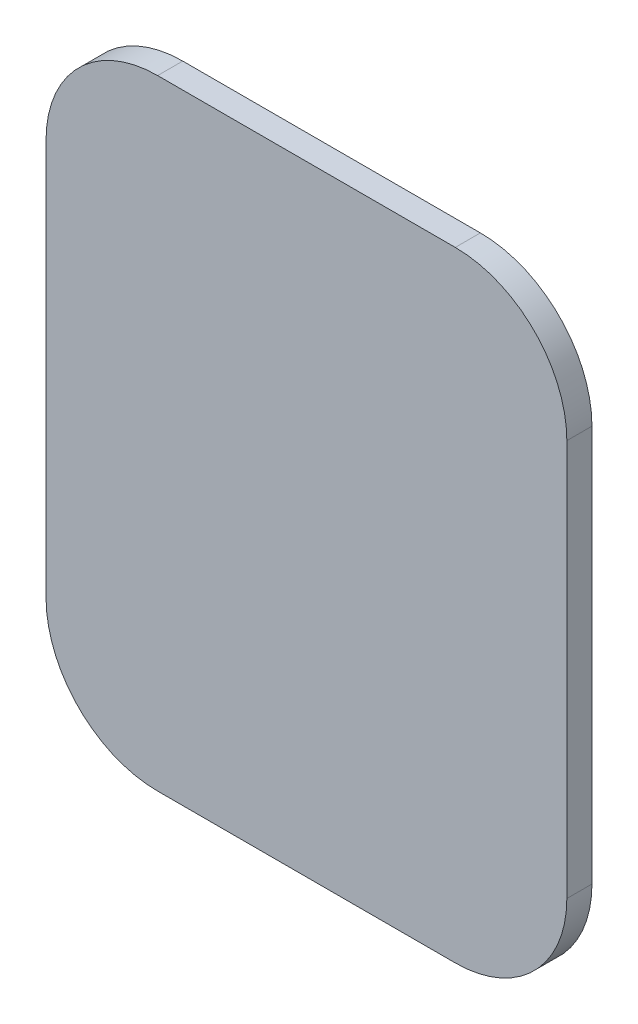
ISO-10303-21;
HEADER;
FILE_DESCRIPTION(('STEP AP214'),'2;1');
FILE_NAME('part.step','',(''),(''),'','','');
FILE_SCHEMA(('AUTOMOTIVE_DESIGN { 1 0 10303 214 1 1 1 1 }'));
ENDSEC;
DATA;
#1=APPLICATION_CONTEXT('core data for automotive mechanical design processes');
#2=APPLICATION_PROTOCOL_DEFINITION('international standard','automotive_design',2000,#1);
#3=PRODUCT_CONTEXT('',#1,'mechanical');
#4=PRODUCT('Part','Part','',(#3));
#5=PRODUCT_RELATED_PRODUCT_CATEGORY('part','',(#4));
#6=PRODUCT_DEFINITION_FORMATION('','',#4);
#7=PRODUCT_DEFINITION_CONTEXT('part definition',#1,'design');
#8=PRODUCT_DEFINITION('design','',#6,#7);
#9=PRODUCT_DEFINITION_SHAPE('','',#8);
#10=(LENGTH_UNIT() NAMED_UNIT(*) SI_UNIT(.MILLI.,.METRE.));
#11=(NAMED_UNIT(*) PLANE_ANGLE_UNIT() SI_UNIT($,.RADIAN.));
#12=(NAMED_UNIT(*) SI_UNIT($,.STERADIAN.) SOLID_ANGLE_UNIT());
#13=UNCERTAINTY_MEASURE_WITH_UNIT(LENGTH_MEASURE(1.E-05),#10,'distance_accuracy_value','');
#14=(GEOMETRIC_REPRESENTATION_CONTEXT(3) GLOBAL_UNCERTAINTY_ASSIGNED_CONTEXT((#13)) GLOBAL_UNIT_ASSIGNED_CONTEXT((#10,
#11,#12)) REPRESENTATION_CONTEXT('',''));
#15=CARTESIAN_POINT('',(0.,0.,0.));
#16=DIRECTION('',(0.,0.,1.));
#17=DIRECTION('',(1.,0.,0.));
#18=AXIS2_PLACEMENT_3D('',#15,#16,#17);
#19=CARTESIAN_POINT('',(0.,0.,0.));
#20=DIRECTION('',(0.,0.,1.));
#21=DIRECTION('',(1.,0.,0.));
#22=AXIS2_PLACEMENT_3D('',#19,#20,#21);
#23=PLANE('',#22);
#24=DIRECTION('',(0.,-1.,0.));
#25=VECTOR('',#24,1.);
#26=CARTESIAN_POINT('',(-18.67,22.215,0.));
#27=LINE('',#26,#25);
#28=CARTESIAN_POINT('',(-18.67,14.215,0.));
#29=VERTEX_POINT('',#28);
#30=CARTESIAN_POINT('',(-18.67,-14.215,0.));
#31=VERTEX_POINT('',#30);
#32=EDGE_CURVE('E170',#29,#31,#27,.T.);
#33=ORIENTED_EDGE('',*,*,#32,.F.);
#34=CARTESIAN_POINT('',(-10.67,14.215,0.));
#35=DIRECTION('',(0.,0.,1.));
#36=DIRECTION('',(1.,0.,0.));
#37=AXIS2_PLACEMENT_3D('',#34,#35,#36);
#38=CIRCLE('',#37,8.);
#39=CARTESIAN_POINT('',(-10.67,22.215,0.));
#40=VERTEX_POINT('',#39);
#41=EDGE_CURVE('E153',#29,#40,#38,.F.);
#42=ORIENTED_EDGE('',*,*,#41,.T.);
#43=DIRECTION('',(-1.,0.,0.));
#44=VECTOR('',#43,1.);
#45=CARTESIAN_POINT('',(-18.67,22.215,0.));
#46=LINE('',#45,#44);
#47=CARTESIAN_POINT('',(10.67,22.215,0.));
#48=VERTEX_POINT('',#47);
#49=EDGE_CURVE('E179',#48,#40,#46,.T.);
#50=ORIENTED_EDGE('',*,*,#49,.F.);
#51=CARTESIAN_POINT('',(10.67,14.215,0.));
#52=DIRECTION('',(0.,0.,1.));
#53=DIRECTION('',(1.,0.,0.));
#54=AXIS2_PLACEMENT_3D('',#51,#52,#53);
#55=CIRCLE('',#54,8.);
#56=CARTESIAN_POINT('',(18.67,14.215,0.));
#57=VERTEX_POINT('',#56);
#58=EDGE_CURVE('E164',#48,#57,#55,.F.);
#59=ORIENTED_EDGE('',*,*,#58,.T.);
#60=DIRECTION('',(0.,1.,0.));
#61=VECTOR('',#60,1.);
#62=CARTESIAN_POINT('',(18.67,22.215,0.));
#63=LINE('',#62,#61);
#64=CARTESIAN_POINT('',(18.67,-14.215,0.));
#65=VERTEX_POINT('',#64);
#66=EDGE_CURVE('E184',#65,#57,#63,.T.);
#67=ORIENTED_EDGE('',*,*,#66,.F.);
#68=CARTESIAN_POINT('',(10.67,-14.215,0.));
#69=DIRECTION('',(0.,0.,1.));
#70=DIRECTION('',(1.,0.,0.));
#71=AXIS2_PLACEMENT_3D('',#68,#69,#70);
#72=CIRCLE('',#71,8.);
#73=CARTESIAN_POINT('',(10.67,-22.215,0.));
#74=VERTEX_POINT('',#73);
#75=EDGE_CURVE('E191',#65,#74,#72,.F.);
#76=ORIENTED_EDGE('',*,*,#75,.T.);
#77=DIRECTION('',(1.,0.,0.));
#78=VECTOR('',#77,1.);
#79=CARTESIAN_POINT('',(-18.67,-22.215,0.));
#80=LINE('',#79,#78);
#81=CARTESIAN_POINT('',(-10.67,-22.215,0.));
#82=VERTEX_POINT('',#81);
#83=EDGE_CURVE('E178',#82,#74,#80,.T.);
#84=ORIENTED_EDGE('',*,*,#83,.F.);
#85=CARTESIAN_POINT('',(-10.67,-14.215,0.));
#86=DIRECTION('',(0.,0.,1.));
#87=DIRECTION('',(1.,0.,0.));
#88=AXIS2_PLACEMENT_3D('',#85,#86,#87);
#89=CIRCLE('',#88,8.);
#90=EDGE_CURVE('E174',#82,#31,#89,.F.);
#91=ORIENTED_EDGE('',*,*,#90,.T.);
#92=EDGE_LOOP('',(#33,#42,#50,#59,#67,#76,#84,#91));
#93=FACE_BOUND('',#92,.T.);
#94=DIRECTION('',(-1.,0.,0.));
#95=VECTOR('',#94,1.);
#96=CARTESIAN_POINT('',(15.5,-17.5,0.));
#97=LINE('',#96,#95);
#98=CARTESIAN_POINT('',(7.5,-17.5,0.));
#99=VERTEX_POINT('',#98);
#100=CARTESIAN_POINT('',(-7.5,-17.5,0.));
#101=VERTEX_POINT('',#100);
#102=EDGE_CURVE('E255',#99,#101,#97,.T.);
#103=ORIENTED_EDGE('',*,*,#102,.F.);
#104=CARTESIAN_POINT('',(7.5,-9.5,0.));
#105=DIRECTION('',(0.,0.,1.));
#106=DIRECTION('',(1.,0.,0.));
#107=AXIS2_PLACEMENT_3D('',#104,#105,#106);
#108=CIRCLE('',#107,8.);
#109=CARTESIAN_POINT('',(15.5,-9.5,0.));
#110=VERTEX_POINT('',#109);
#111=EDGE_CURVE('E242',#99,#110,#108,.T.);
#112=ORIENTED_EDGE('',*,*,#111,.T.);
#113=DIRECTION('',(0.,-1.,0.));
#114=VECTOR('',#113,1.);
#115=CARTESIAN_POINT('',(15.5,17.5,0.));
#116=LINE('',#115,#114);
#117=CARTESIAN_POINT('',(15.5,9.5,0.));
#118=VERTEX_POINT('',#117);
#119=EDGE_CURVE('E280',#118,#110,#116,.T.);
#120=ORIENTED_EDGE('',*,*,#119,.F.);
#121=CARTESIAN_POINT('',(7.5,9.5,0.));
#122=DIRECTION('',(0.,0.,1.));
#123=DIRECTION('',(1.,0.,0.));
#124=AXIS2_PLACEMENT_3D('',#121,#122,#123);
#125=CIRCLE('',#124,8.);
#126=CARTESIAN_POINT('',(7.5,17.5,0.));
#127=VERTEX_POINT('',#126);
#128=EDGE_CURVE('E11',#118,#127,#125,.T.);
#129=ORIENTED_EDGE('',*,*,#128,.T.);
#130=DIRECTION('',(-1.,0.,0.));
#131=VECTOR('',#130,1.);
#132=CARTESIAN_POINT('',(15.5,17.5,0.));
#133=LINE('',#132,#131);
#134=CARTESIAN_POINT('',(-7.5,17.5,0.));
#135=VERTEX_POINT('',#134);
#136=EDGE_CURVE('E249',#127,#135,#133,.T.);
#137=ORIENTED_EDGE('',*,*,#136,.T.);
#138=CARTESIAN_POINT('',(-7.5,9.5,0.));
#139=DIRECTION('',(0.,0.,1.));
#140=DIRECTION('',(1.,0.,0.));
#141=AXIS2_PLACEMENT_3D('',#138,#139,#140);
#142=CIRCLE('',#141,8.);
#143=CARTESIAN_POINT('',(-15.5,9.5,0.));
#144=VERTEX_POINT('',#143);
#145=EDGE_CURVE('E49',#135,#144,#142,.T.);
#146=ORIENTED_EDGE('',*,*,#145,.T.);
#147=DIRECTION('',(0.,-1.,0.));
#148=VECTOR('',#147,1.);
#149=CARTESIAN_POINT('',(-15.5,17.5,0.));
#150=LINE('',#149,#148);
#151=CARTESIAN_POINT('',(-15.5,-9.5,0.));
#152=VERTEX_POINT('',#151);
#153=EDGE_CURVE('E248',#144,#152,#150,.T.);
#154=ORIENTED_EDGE('',*,*,#153,.T.);
#155=CARTESIAN_POINT('',(-7.5,-9.5,0.));
#156=DIRECTION('',(0.,0.,1.));
#157=DIRECTION('',(1.,0.,0.));
#158=AXIS2_PLACEMENT_3D('',#155,#156,#157);
#159=CIRCLE('',#158,8.);
#160=EDGE_CURVE('E244',#152,#101,#159,.T.);
#161=ORIENTED_EDGE('',*,*,#160,.T.);
#162=EDGE_LOOP('',(#103,#112,#120,#129,#137,#146,#154,#161));
#163=FACE_BOUND('',#162,.T.);
#164=ADVANCED_FACE('F41',(#93,#163),#23,.F.);
#165=CARTESIAN_POINT('',(18.67,22.215,1.8));
#166=DIRECTION('',(-1.,0.,0.));
#167=DIRECTION('',(0.,0.,1.));
#168=AXIS2_PLACEMENT_3D('',#165,#166,#167);
#169=PLANE('',#168);
#170=ORIENTED_EDGE('',*,*,#66,.T.);
#171=DIRECTION('',(0.,0.,-1.));
#172=VECTOR('',#171,1.);
#173=CARTESIAN_POINT('',(18.67,14.215,1.8));
#174=LINE('',#173,#172);
#175=CARTESIAN_POINT('',(18.67,14.215,1.8));
#176=VERTEX_POINT('',#175);
#177=EDGE_CURVE('E208',#57,#176,#174,.F.);
#178=ORIENTED_EDGE('',*,*,#177,.T.);
#179=DIRECTION('',(0.,1.,0.));
#180=VECTOR('',#179,1.);
#181=CARTESIAN_POINT('',(18.67,22.215,1.8));
#182=LINE('',#181,#180);
#183=CARTESIAN_POINT('',(18.67,-14.215,1.8));
#184=VERTEX_POINT('',#183);
#185=EDGE_CURVE('E182',#184,#176,#182,.T.);
#186=ORIENTED_EDGE('',*,*,#185,.F.);
#187=DIRECTION('',(0.,0.,-1.));
#188=VECTOR('',#187,1.);
#189=CARTESIAN_POINT('',(18.67,-14.215,1.8));
#190=LINE('',#189,#188);
#191=EDGE_CURVE('E205',#184,#65,#190,.T.);
#192=ORIENTED_EDGE('',*,*,#191,.T.);
#193=EDGE_LOOP('',(#170,#178,#186,#192));
#194=FACE_BOUND('',#193,.T.);
#195=ADVANCED_FACE('F294',(#194),#169,.F.);
#196=CARTESIAN_POINT('',(-18.67,22.215,1.8));
#197=DIRECTION('',(0.,-1.,0.));
#198=DIRECTION('',(0.,0.,-1.));
#199=AXIS2_PLACEMENT_3D('',#196,#197,#198);
#200=PLANE('',#199);
#201=ORIENTED_EDGE('',*,*,#49,.T.);
#202=DIRECTION('',(0.,0.,-1.));
#203=VECTOR('',#202,1.);
#204=CARTESIAN_POINT('',(-10.67,22.215,1.8));
#205=LINE('',#204,#203);
#206=CARTESIAN_POINT('',(-10.67,22.215,1.8));
#207=VERTEX_POINT('',#206);
#208=EDGE_CURVE('E158',#40,#207,#205,.F.);
#209=ORIENTED_EDGE('',*,*,#208,.T.);
#210=DIRECTION('',(-1.,0.,0.));
#211=VECTOR('',#210,1.);
#212=CARTESIAN_POINT('',(-18.67,22.215,1.8));
#213=LINE('',#212,#211);
#214=CARTESIAN_POINT('',(10.67,22.215,1.8));
#215=VERTEX_POINT('',#214);
#216=EDGE_CURVE('E285',#215,#207,#213,.T.);
#217=ORIENTED_EDGE('',*,*,#216,.F.);
#218=DIRECTION('',(0.,0.,-1.));
#219=VECTOR('',#218,1.);
#220=CARTESIAN_POINT('',(10.67,22.215,1.8));
#221=LINE('',#220,#219);
#222=EDGE_CURVE('E163',#215,#48,#221,.T.);
#223=ORIENTED_EDGE('',*,*,#222,.T.);
#224=EDGE_LOOP('',(#201,#209,#217,#223));
#225=FACE_BOUND('',#224,.T.);
#226=ADVANCED_FACE('F305',(#225),#200,.F.);
#227=CARTESIAN_POINT('',(-18.67,22.215,1.8));
#228=DIRECTION('',(1.,0.,0.));
#229=DIRECTION('',(0.,0.,-1.));
#230=AXIS2_PLACEMENT_3D('',#227,#228,#229);
#231=PLANE('',#230);
#232=DIRECTION('',(0.,-1.,0.));
#233=VECTOR('',#232,1.);
#234=CARTESIAN_POINT('',(-18.67,22.215,1.8));
#235=LINE('',#234,#233);
#236=CARTESIAN_POINT('',(-18.67,14.215,1.8));
#237=VERTEX_POINT('',#236);
#238=CARTESIAN_POINT('',(-18.67,-14.215,1.8));
#239=VERTEX_POINT('',#238);
#240=EDGE_CURVE('E173',#237,#239,#235,.T.);
#241=ORIENTED_EDGE('',*,*,#240,.F.);
#242=DIRECTION('',(0.,0.,-1.));
#243=VECTOR('',#242,1.);
#244=CARTESIAN_POINT('',(-18.67,14.215,1.8));
#245=LINE('',#244,#243);
#246=EDGE_CURVE('E157',#237,#29,#245,.T.);
#247=ORIENTED_EDGE('',*,*,#246,.T.);
#248=ORIENTED_EDGE('',*,*,#32,.T.);
#249=DIRECTION('',(0.,0.,-1.));
#250=VECTOR('',#249,1.);
#251=CARTESIAN_POINT('',(-18.67,-14.215,1.8));
#252=LINE('',#251,#250);
#253=EDGE_CURVE('E175',#31,#239,#252,.F.);
#254=ORIENTED_EDGE('',*,*,#253,.T.);
#255=EDGE_LOOP('',(#241,#247,#248,#254));
#256=FACE_BOUND('',#255,.T.);
#257=ADVANCED_FACE('F169',(#256),#231,.F.);
#258=CARTESIAN_POINT('',(-18.67,-22.215,1.8));
#259=DIRECTION('',(0.,1.,0.));
#260=DIRECTION('',(0.,0.,1.));
#261=AXIS2_PLACEMENT_3D('',#258,#259,#260);
#262=PLANE('',#261);
#263=ORIENTED_EDGE('',*,*,#83,.T.);
#264=DIRECTION('',(0.,0.,-1.));
#265=VECTOR('',#264,1.);
#266=CARTESIAN_POINT('',(10.67,-22.215,1.8));
#267=LINE('',#266,#265);
#268=CARTESIAN_POINT('',(10.67,-22.215,1.8));
#269=VERTEX_POINT('',#268);
#270=EDGE_CURVE('E213',#74,#269,#267,.F.);
#271=ORIENTED_EDGE('',*,*,#270,.T.);
#272=DIRECTION('',(1.,0.,0.));
#273=VECTOR('',#272,1.);
#274=CARTESIAN_POINT('',(-18.67,-22.215,1.8));
#275=LINE('',#274,#273);
#276=CARTESIAN_POINT('',(-10.67,-22.215,1.8));
#277=VERTEX_POINT('',#276);
#278=EDGE_CURVE('E188',#277,#269,#275,.T.);
#279=ORIENTED_EDGE('',*,*,#278,.F.);
#280=DIRECTION('',(0.,0.,-1.));
#281=VECTOR('',#280,1.);
#282=CARTESIAN_POINT('',(-10.67,-22.215,1.8));
#283=LINE('',#282,#281);
#284=EDGE_CURVE('E210',#277,#82,#283,.T.);
#285=ORIENTED_EDGE('',*,*,#284,.T.);
#286=EDGE_LOOP('',(#263,#271,#279,#285));
#287=FACE_BOUND('',#286,.T.);
#288=ADVANCED_FACE('F312',(#287),#262,.F.);
#289=CARTESIAN_POINT('',(0.,0.,1.8));
#290=DIRECTION('',(0.,0.,1.));
#291=DIRECTION('',(1.,0.,0.));
#292=AXIS2_PLACEMENT_3D('',#289,#290,#291);
#293=PLANE('',#292);
#294=ORIENTED_EDGE('',*,*,#216,.T.);
#295=CARTESIAN_POINT('',(-10.67,14.215,1.8));
#296=DIRECTION('',(0.,0.,1.));
#297=DIRECTION('',(1.,0.,0.));
#298=AXIS2_PLACEMENT_3D('',#295,#296,#297);
#299=CIRCLE('',#298,8.);
#300=EDGE_CURVE('E203',#207,#237,#299,.T.);
#301=ORIENTED_EDGE('',*,*,#300,.T.);
#302=ORIENTED_EDGE('',*,*,#240,.T.);
#303=CARTESIAN_POINT('',(-10.67,-14.215,1.8));
#304=DIRECTION('',(0.,0.,1.));
#305=DIRECTION('',(1.,0.,0.));
#306=AXIS2_PLACEMENT_3D('',#303,#304,#305);
#307=CIRCLE('',#306,8.);
#308=EDGE_CURVE('E197',#239,#277,#307,.T.);
#309=ORIENTED_EDGE('',*,*,#308,.T.);
#310=ORIENTED_EDGE('',*,*,#278,.T.);
#311=CARTESIAN_POINT('',(10.67,-14.215,1.8));
#312=DIRECTION('',(0.,0.,1.));
#313=DIRECTION('',(1.,0.,0.));
#314=AXIS2_PLACEMENT_3D('',#311,#312,#313);
#315=CIRCLE('',#314,8.);
#316=EDGE_CURVE('E199',#269,#184,#315,.T.);
#317=ORIENTED_EDGE('',*,*,#316,.T.);
#318=ORIENTED_EDGE('',*,*,#185,.T.);
#319=CARTESIAN_POINT('',(10.67,14.215,1.8));
#320=DIRECTION('',(0.,0.,1.));
#321=DIRECTION('',(1.,0.,0.));
#322=AXIS2_PLACEMENT_3D('',#319,#320,#321);
#323=CIRCLE('',#322,8.);
#324=EDGE_CURVE('E201',#176,#215,#323,.T.);
#325=ORIENTED_EDGE('',*,*,#324,.T.);
#326=EDGE_LOOP('',(#294,#301,#302,#309,#310,#317,#318,#325));
#327=FACE_BOUND('',#326,.T.);
#328=ADVANCED_FACE('F303',(#327),#293,.T.);
#329=CARTESIAN_POINT('',(15.5,-17.5,-1.89));
#330=DIRECTION('',(0.,1.,0.));
#331=DIRECTION('',(0.,0.,1.));
#332=AXIS2_PLACEMENT_3D('',#329,#330,#331);
#333=PLANE('',#332);
#334=DIRECTION('',(-1.,0.,0.));
#335=VECTOR('',#334,1.);
#336=CARTESIAN_POINT('',(15.5,-17.5,-1.89));
#337=LINE('',#336,#335);
#338=CARTESIAN_POINT('',(7.5,-17.5,-1.89));
#339=VERTEX_POINT('',#338);
#340=CARTESIAN_POINT('',(-7.5,-17.5,-1.89));
#341=VERTEX_POINT('',#340);
#342=EDGE_CURVE('E273',#339,#341,#337,.T.);
#343=ORIENTED_EDGE('',*,*,#342,.F.);
#344=DIRECTION('',(0.,0.,1.));
#345=VECTOR('',#344,1.);
#346=CARTESIAN_POINT('',(7.5,-17.5,-1.89));
#347=LINE('',#346,#345);
#348=EDGE_CURVE('E217',#339,#99,#347,.T.);
#349=ORIENTED_EDGE('',*,*,#348,.T.);
#350=ORIENTED_EDGE('',*,*,#102,.T.);
#351=DIRECTION('',(0.,0.,1.));
#352=VECTOR('',#351,1.);
#353=CARTESIAN_POINT('',(-7.5,-17.5,-1.89));
#354=LINE('',#353,#352);
#355=EDGE_CURVE('E215',#101,#341,#354,.F.);
#356=ORIENTED_EDGE('',*,*,#355,.T.);
#357=EDGE_LOOP('',(#343,#349,#350,#356));
#358=FACE_BOUND('',#357,.T.);
#359=ADVANCED_FACE('F329',(#358),#333,.F.);
#360=CARTESIAN_POINT('',(-15.5,17.5,-1.89));
#361=DIRECTION('',(-1.,0.,0.));
#362=DIRECTION('',(0.,0.,1.));
#363=AXIS2_PLACEMENT_3D('',#360,#361,#362);
#364=PLANE('',#363);
#365=DIRECTION('',(0.,-1.,0.));
#366=VECTOR('',#365,1.);
#367=CARTESIAN_POINT('',(-15.5,17.5,-1.89));
#368=LINE('',#367,#366);
#369=CARTESIAN_POINT('',(-15.5,9.5,-1.89));
#370=VERTEX_POINT('',#369);
#371=CARTESIAN_POINT('',(-15.5,-9.5,-1.89));
#372=VERTEX_POINT('',#371);
#373=EDGE_CURVE('E266',#370,#372,#368,.T.);
#374=ORIENTED_EDGE('',*,*,#373,.T.);
#375=DIRECTION('',(0.,0.,1.));
#376=VECTOR('',#375,1.);
#377=CARTESIAN_POINT('',(-15.5,-9.5,0.));
#378=LINE('',#377,#376);
#379=EDGE_CURVE('E235',#372,#152,#378,.T.);
#380=ORIENTED_EDGE('',*,*,#379,.T.);
#381=ORIENTED_EDGE('',*,*,#153,.F.);
#382=DIRECTION('',(0.,0.,1.));
#383=VECTOR('',#382,1.);
#384=CARTESIAN_POINT('',(-15.5,9.5,-1.89));
#385=LINE('',#384,#383);
#386=EDGE_CURVE('E233',#144,#370,#385,.F.);
#387=ORIENTED_EDGE('',*,*,#386,.T.);
#388=EDGE_LOOP('',(#374,#380,#381,#387));
#389=FACE_BOUND('',#388,.T.);
#390=ADVANCED_FACE('F252',(#389),#364,.T.);
#391=CARTESIAN_POINT('',(15.5,17.5,-1.89));
#392=DIRECTION('',(0.,1.,0.));
#393=DIRECTION('',(0.,0.,1.));
#394=AXIS2_PLACEMENT_3D('',#391,#392,#393);
#395=PLANE('',#394);
#396=DIRECTION('',(-1.,0.,0.));
#397=VECTOR('',#396,1.);
#398=CARTESIAN_POINT('',(15.5,17.5,-1.89));
#399=LINE('',#398,#397);
#400=CARTESIAN_POINT('',(7.5,17.5,-1.89));
#401=VERTEX_POINT('',#400);
#402=CARTESIAN_POINT('',(-7.5,17.5,-1.89));
#403=VERTEX_POINT('',#402);
#404=EDGE_CURVE('E264',#401,#403,#399,.T.);
#405=ORIENTED_EDGE('',*,*,#404,.T.);
#406=DIRECTION('',(0.,0.,1.));
#407=VECTOR('',#406,1.);
#408=CARTESIAN_POINT('',(-7.5,17.5,-1.89));
#409=LINE('',#408,#407);
#410=EDGE_CURVE('E240',#403,#135,#409,.T.);
#411=ORIENTED_EDGE('',*,*,#410,.T.);
#412=ORIENTED_EDGE('',*,*,#136,.F.);
#413=DIRECTION('',(0.,0.,1.));
#414=VECTOR('',#413,1.);
#415=CARTESIAN_POINT('',(7.5,17.5,-1.89));
#416=LINE('',#415,#414);
#417=EDGE_CURVE('E238',#127,#401,#416,.F.);
#418=ORIENTED_EDGE('',*,*,#417,.T.);
#419=EDGE_LOOP('',(#405,#411,#412,#418));
#420=FACE_BOUND('',#419,.T.);
#421=ADVANCED_FACE('F268',(#420),#395,.T.);
#422=CARTESIAN_POINT('',(15.5,17.5,-1.89));
#423=DIRECTION('',(-1.,0.,0.));
#424=DIRECTION('',(0.,0.,1.));
#425=AXIS2_PLACEMENT_3D('',#422,#423,#424);
#426=PLANE('',#425);
#427=ORIENTED_EDGE('',*,*,#119,.T.);
#428=DIRECTION('',(0.,0.,1.));
#429=VECTOR('',#428,1.);
#430=CARTESIAN_POINT('',(15.5,-9.5,-1.89));
#431=LINE('',#430,#429);
#432=CARTESIAN_POINT('',(15.5,-9.5,-1.89));
#433=VERTEX_POINT('',#432);
#434=EDGE_CURVE('E223',#110,#433,#431,.F.);
#435=ORIENTED_EDGE('',*,*,#434,.T.);
#436=DIRECTION('',(0.,-1.,0.));
#437=VECTOR('',#436,1.);
#438=CARTESIAN_POINT('',(15.5,17.5,-1.89));
#439=LINE('',#438,#437);
#440=CARTESIAN_POINT('',(15.5,9.5,-1.89));
#441=VERTEX_POINT('',#440);
#442=EDGE_CURVE('E270',#441,#433,#439,.T.);
#443=ORIENTED_EDGE('',*,*,#442,.F.);
#444=DIRECTION('',(0.,0.,1.));
#445=VECTOR('',#444,1.);
#446=CARTESIAN_POINT('',(15.5,9.5,0.));
#447=LINE('',#446,#445);
#448=EDGE_CURVE('E220',#441,#118,#447,.T.);
#449=ORIENTED_EDGE('',*,*,#448,.T.);
#450=EDGE_LOOP('',(#427,#435,#443,#449));
#451=FACE_BOUND('',#450,.T.);
#452=ADVANCED_FACE('F364',(#451),#426,.F.);
#453=CARTESIAN_POINT('',(0.,0.,-1.89));
#454=DIRECTION('',(0.,0.,1.));
#455=DIRECTION('',(1.,0.,0.));
#456=AXIS2_PLACEMENT_3D('',#453,#454,#455);
#457=PLANE('',#456);
#458=ORIENTED_EDGE('',*,*,#442,.T.);
#459=CARTESIAN_POINT('',(7.5,-9.5,-1.89));
#460=DIRECTION('',(0.,0.,1.));
#461=DIRECTION('',(1.,0.,0.));
#462=AXIS2_PLACEMENT_3D('',#459,#460,#461);
#463=CIRCLE('',#462,8.);
#464=EDGE_CURVE('E231',#433,#339,#463,.F.);
#465=ORIENTED_EDGE('',*,*,#464,.T.);
#466=ORIENTED_EDGE('',*,*,#342,.T.);
#467=CARTESIAN_POINT('',(-7.5,-9.5,-1.89));
#468=DIRECTION('',(0.,0.,1.));
#469=DIRECTION('',(1.,0.,0.));
#470=AXIS2_PLACEMENT_3D('',#467,#468,#469);
#471=CIRCLE('',#470,8.);
#472=EDGE_CURVE('E229',#341,#372,#471,.F.);
#473=ORIENTED_EDGE('',*,*,#472,.T.);
#474=ORIENTED_EDGE('',*,*,#373,.F.);
#475=CARTESIAN_POINT('',(-7.5,9.5,-1.89));
#476=DIRECTION('',(0.,0.,1.));
#477=DIRECTION('',(1.,0.,0.));
#478=AXIS2_PLACEMENT_3D('',#475,#476,#477);
#479=CIRCLE('',#478,8.);
#480=EDGE_CURVE('E227',#370,#403,#479,.F.);
#481=ORIENTED_EDGE('',*,*,#480,.T.);
#482=ORIENTED_EDGE('',*,*,#404,.F.);
#483=CARTESIAN_POINT('',(7.5,9.5,-1.89));
#484=DIRECTION('',(0.,0.,1.));
#485=DIRECTION('',(1.,0.,0.));
#486=AXIS2_PLACEMENT_3D('',#483,#484,#485);
#487=CIRCLE('',#486,8.);
#488=EDGE_CURVE('E225',#401,#441,#487,.F.);
#489=ORIENTED_EDGE('',*,*,#488,.T.);
#490=EDGE_LOOP('',(#458,#465,#466,#473,#474,#481,#482,#489));
#491=FACE_BOUND('',#490,.T.);
#492=ADVANCED_FACE('F263',(#491),#457,.F.);
#493=CARTESIAN_POINT('',(-10.67,14.215,1.8));
#494=DIRECTION('',(0.,0.,-1.));
#495=DIRECTION('',(-1.,0.,0.));
#496=AXIS2_PLACEMENT_3D('',#493,#494,#495);
#497=CYLINDRICAL_SURFACE('',#496,8.);
#498=ORIENTED_EDGE('',*,*,#300,.F.);
#499=ORIENTED_EDGE('',*,*,#208,.F.);
#500=ORIENTED_EDGE('',*,*,#41,.F.);
#501=ORIENTED_EDGE('',*,*,#246,.F.);
#502=EDGE_LOOP('',(#498,#499,#500,#501));
#503=FACE_BOUND('',#502,.T.);
#504=ADVANCED_FACE('F156',(#503),#497,.T.);
#505=CARTESIAN_POINT('',(10.67,14.215,1.8));
#506=DIRECTION('',(0.,0.,-1.));
#507=DIRECTION('',(-1.,0.,0.));
#508=AXIS2_PLACEMENT_3D('',#505,#506,#507);
#509=CYLINDRICAL_SURFACE('',#508,8.);
#510=ORIENTED_EDGE('',*,*,#324,.F.);
#511=ORIENTED_EDGE('',*,*,#177,.F.);
#512=ORIENTED_EDGE('',*,*,#58,.F.);
#513=ORIENTED_EDGE('',*,*,#222,.F.);
#514=EDGE_LOOP('',(#510,#511,#512,#513));
#515=FACE_BOUND('',#514,.T.);
#516=ADVANCED_FACE('F299',(#515),#509,.T.);
#517=CARTESIAN_POINT('',(10.67,-14.215,1.8));
#518=DIRECTION('',(0.,0.,-1.));
#519=DIRECTION('',(-1.,0.,0.));
#520=AXIS2_PLACEMENT_3D('',#517,#518,#519);
#521=CYLINDRICAL_SURFACE('',#520,8.);
#522=ORIENTED_EDGE('',*,*,#316,.F.);
#523=ORIENTED_EDGE('',*,*,#270,.F.);
#524=ORIENTED_EDGE('',*,*,#75,.F.);
#525=ORIENTED_EDGE('',*,*,#191,.F.);
#526=EDGE_LOOP('',(#522,#523,#524,#525));
#527=FACE_BOUND('',#526,.T.);
#528=ADVANCED_FACE('F335',(#527),#521,.T.);
#529=CARTESIAN_POINT('',(-10.67,-14.215,1.8));
#530=DIRECTION('',(0.,0.,-1.));
#531=DIRECTION('',(-1.,0.,0.));
#532=AXIS2_PLACEMENT_3D('',#529,#530,#531);
#533=CYLINDRICAL_SURFACE('',#532,8.);
#534=ORIENTED_EDGE('',*,*,#308,.F.);
#535=ORIENTED_EDGE('',*,*,#253,.F.);
#536=ORIENTED_EDGE('',*,*,#90,.F.);
#537=ORIENTED_EDGE('',*,*,#284,.F.);
#538=EDGE_LOOP('',(#534,#535,#536,#537));
#539=FACE_BOUND('',#538,.T.);
#540=ADVANCED_FACE('F338',(#539),#533,.T.);
#541=CARTESIAN_POINT('',(7.5,-9.5,-1.89));
#542=DIRECTION('',(0.,0.,1.));
#543=DIRECTION('',(1.,0.,0.));
#544=AXIS2_PLACEMENT_3D('',#541,#542,#543);
#545=CYLINDRICAL_SURFACE('',#544,8.);
#546=ORIENTED_EDGE('',*,*,#464,.F.);
#547=ORIENTED_EDGE('',*,*,#434,.F.);
#548=ORIENTED_EDGE('',*,*,#111,.F.);
#549=ORIENTED_EDGE('',*,*,#348,.F.);
#550=EDGE_LOOP('',(#546,#547,#548,#549));
#551=FACE_BOUND('',#550,.T.);
#552=ADVANCED_FACE('F339',(#551),#545,.T.);
#553=CARTESIAN_POINT('',(-7.5,-9.5,-1.89));
#554=DIRECTION('',(0.,0.,-1.));
#555=DIRECTION('',(-1.,0.,0.));
#556=AXIS2_PLACEMENT_3D('',#553,#554,#555);
#557=CYLINDRICAL_SURFACE('',#556,8.);
#558=ORIENTED_EDGE('',*,*,#472,.F.);
#559=ORIENTED_EDGE('',*,*,#355,.F.);
#560=ORIENTED_EDGE('',*,*,#160,.F.);
#561=ORIENTED_EDGE('',*,*,#379,.F.);
#562=EDGE_LOOP('',(#558,#559,#560,#561));
#563=FACE_BOUND('',#562,.T.);
#564=ADVANCED_FACE('F345',(#563),#557,.T.);
#565=CARTESIAN_POINT('',(-7.5,9.5,-1.89));
#566=DIRECTION('',(0.,0.,1.));
#567=DIRECTION('',(1.,0.,0.));
#568=AXIS2_PLACEMENT_3D('',#565,#566,#567);
#569=CYLINDRICAL_SURFACE('',#568,8.);
#570=ORIENTED_EDGE('',*,*,#480,.F.);
#571=ORIENTED_EDGE('',*,*,#386,.F.);
#572=ORIENTED_EDGE('',*,*,#145,.F.);
#573=ORIENTED_EDGE('',*,*,#410,.F.);
#574=EDGE_LOOP('',(#570,#571,#572,#573));
#575=FACE_BOUND('',#574,.T.);
#576=ADVANCED_FACE('F258',(#575),#569,.T.);
#577=CARTESIAN_POINT('',(7.5,9.5,-1.89));
#578=DIRECTION('',(0.,0.,-1.));
#579=DIRECTION('',(-1.,0.,0.));
#580=AXIS2_PLACEMENT_3D('',#577,#578,#579);
#581=CYLINDRICAL_SURFACE('',#580,8.);
#582=ORIENTED_EDGE('',*,*,#488,.F.);
#583=ORIENTED_EDGE('',*,*,#417,.F.);
#584=ORIENTED_EDGE('',*,*,#128,.F.);
#585=ORIENTED_EDGE('',*,*,#448,.F.);
#586=EDGE_LOOP('',(#582,#583,#584,#585));
#587=FACE_BOUND('',#586,.T.);
#588=ADVANCED_FACE('F43',(#587),#581,.T.);
#589=CLOSED_SHELL('',(#164,#195,#226,#257,#288,#328,#359,#390,#421,#452,#492,#504,#516,#528,
#540,#552,#564,#576,#588));
#590=MANIFOLD_SOLID_BREP('B2',#589);
#591=ADVANCED_BREP_SHAPE_REPRESENTATION('',(#18,#590),#14);
#592=SHAPE_DEFINITION_REPRESENTATION(#9,#591);
ENDSEC;
END-ISO-10303-21;
